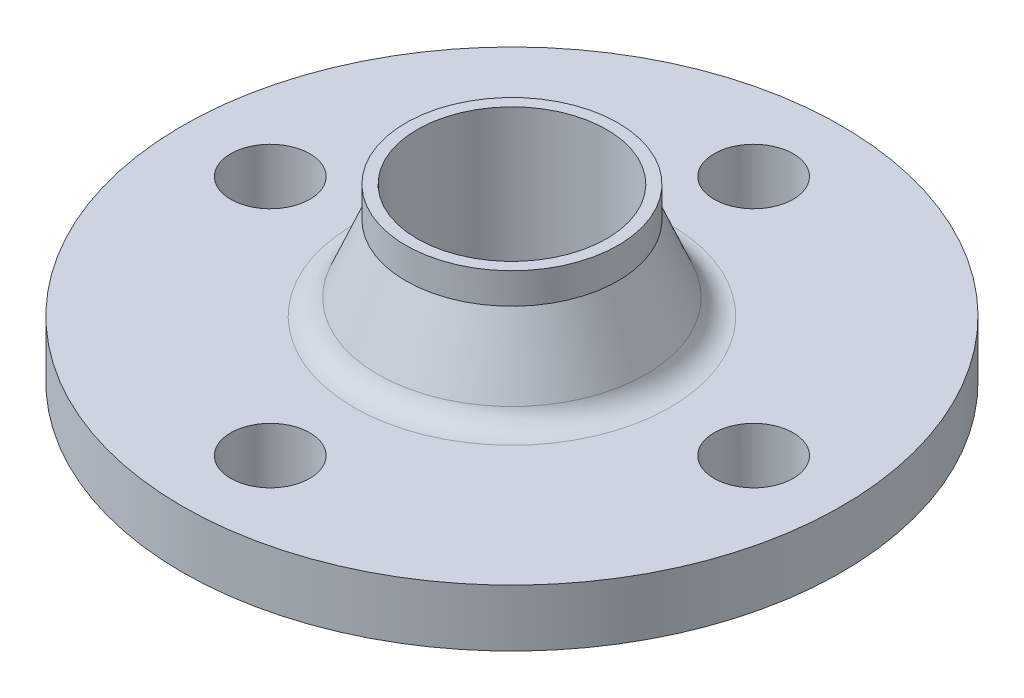
ISO-10303-21;
HEADER;
FILE_DESCRIPTION(('STEP AP214'),'2;1');
FILE_NAME('part.step','',(''),(''),'','','');
FILE_SCHEMA(('AUTOMOTIVE_DESIGN { 1 0 10303 214 1 1 1 1 }'));
ENDSEC;
DATA;
#1=APPLICATION_CONTEXT('core data for automotive mechanical design processes');
#2=APPLICATION_PROTOCOL_DEFINITION('international standard','automotive_design',2000,#1);
#3=PRODUCT_CONTEXT('',#1,'mechanical');
#4=PRODUCT('Part','Part','',(#3));
#5=PRODUCT_RELATED_PRODUCT_CATEGORY('part','',(#4));
#6=PRODUCT_DEFINITION_FORMATION('','',#4);
#7=PRODUCT_DEFINITION_CONTEXT('part definition',#1,'design');
#8=PRODUCT_DEFINITION('design','',#6,#7);
#9=PRODUCT_DEFINITION_SHAPE('','',#8);
#10=(LENGTH_UNIT() NAMED_UNIT(*) SI_UNIT(.MILLI.,.METRE.));
#11=(NAMED_UNIT(*) PLANE_ANGLE_UNIT() SI_UNIT($,.RADIAN.));
#12=(NAMED_UNIT(*) SI_UNIT($,.STERADIAN.) SOLID_ANGLE_UNIT());
#13=UNCERTAINTY_MEASURE_WITH_UNIT(LENGTH_MEASURE(1.E-05),#10,'distance_accuracy_value','');
#14=(GEOMETRIC_REPRESENTATION_CONTEXT(3) GLOBAL_UNCERTAINTY_ASSIGNED_CONTEXT((#13)) GLOBAL_UNIT_ASSIGNED_CONTEXT((#10,
#11,#12)) REPRESENTATION_CONTEXT('',''));
#15=CARTESIAN_POINT('',(0.,0.,0.));
#16=DIRECTION('',(0.,0.,1.));
#17=DIRECTION('',(1.,0.,0.));
#18=AXIS2_PLACEMENT_3D('',#15,#16,#17);
#19=CARTESIAN_POINT('',(75.,3.00000000000002,0.));
#20=DIRECTION('',(0.,-1.,0.));
#21=DIRECTION('',(0.,0.,-1.));
#22=AXIS2_PLACEMENT_3D('',#19,#20,#21);
#23=PLANE('',#22);
#24=CARTESIAN_POINT('',(-55.,2.99999999999999,-3.84063169722032E-13));
#25=DIRECTION('',(0.,1.,0.));
#26=DIRECTION('',(0.,0.,1.));
#27=AXIS2_PLACEMENT_3D('',#24,#25,#26);
#28=CIRCLE('',#27,9.);
#29=CARTESIAN_POINT('',(-46.8454545454546,3.00000000000002,-3.80833144956622));
#30=VERTEX_POINT('',#29);
#31=CARTESIAN_POINT('',(-46.8454545454546,2.99999999999999,3.80833144956551));
#32=VERTEX_POINT('',#31);
#33=EDGE_CURVE('E86',#30,#32,#28,.T.);
#34=ORIENTED_EDGE('',*,*,#33,.T.);
#35=CARTESIAN_POINT('',(0.,3.00000000000002,0.));
#36=DIRECTION('',(0.,-1.,0.));
#37=DIRECTION('',(0.,0.,-1.));
#38=AXIS2_PLACEMENT_3D('',#35,#36,#37);
#39=CIRCLE('',#38,47.);
#40=CARTESIAN_POINT('',(-3.80833144956606,3.00000000000002,46.8454545454546));
#41=VERTEX_POINT('',#40);
#42=EDGE_CURVE('E78',#41,#32,#39,.T.);
#43=ORIENTED_EDGE('',*,*,#42,.F.);
#44=CARTESIAN_POINT('',(-1.90445551968694E-13,2.99999999999999,55.));
#45=DIRECTION('',(0.,1.,0.));
#46=DIRECTION('',(0.,0.,1.));
#47=AXIS2_PLACEMENT_3D('',#44,#45,#46);
#48=CIRCLE('',#47,9.00000000000001);
#49=CARTESIAN_POINT('',(3.80833144956567,2.99999999999999,46.8454545454546));
#50=VERTEX_POINT('',#49);
#51=EDGE_CURVE('E117',#41,#50,#48,.T.);
#52=ORIENTED_EDGE('',*,*,#51,.T.);
#53=CARTESIAN_POINT('',(46.8454545454546,2.99999999999999,3.80833144956583));
#54=VERTEX_POINT('',#53);
#55=EDGE_CURVE('E81',#54,#50,#39,.T.);
#56=ORIENTED_EDGE('',*,*,#55,.F.);
#57=CARTESIAN_POINT('',(55.,2.99999999999999,0.));
#58=DIRECTION('',(0.,1.,0.));
#59=DIRECTION('',(0.,0.,1.));
#60=AXIS2_PLACEMENT_3D('',#57,#58,#59);
#61=CIRCLE('',#60,9.);
#62=CARTESIAN_POINT('',(46.8454545454546,3.00000000000002,-3.8083314495659));
#63=VERTEX_POINT('',#62);
#64=EDGE_CURVE('E140',#54,#63,#61,.T.);
#65=ORIENTED_EDGE('',*,*,#64,.T.);
#66=CARTESIAN_POINT('',(3.80833144956639,3.00000000000002,-46.8454545454545));
#67=VERTEX_POINT('',#66);
#68=EDGE_CURVE('E103',#67,#63,#39,.T.);
#69=ORIENTED_EDGE('',*,*,#68,.F.);
#70=CARTESIAN_POINT('',(5.7768078747537E-13,2.99999999999999,-55.));
#71=DIRECTION('',(0.,1.,0.));
#72=DIRECTION('',(0.,0.,1.));
#73=AXIS2_PLACEMENT_3D('',#70,#71,#72);
#74=CIRCLE('',#73,9.00000000000001);
#75=CARTESIAN_POINT('',(-3.80833144956535,2.99999999999999,-46.8454545454546));
#76=VERTEX_POINT('',#75);
#77=EDGE_CURVE('E127',#67,#76,#74,.T.);
#78=ORIENTED_EDGE('',*,*,#77,.T.);
#79=EDGE_CURVE('E79',#30,#76,#39,.T.);
#80=ORIENTED_EDGE('',*,*,#79,.F.);
#81=EDGE_LOOP('',(#34,#43,#52,#56,#65,#69,#78,#80));
#82=FACE_BOUND('',#81,.T.);
#83=CARTESIAN_POINT('',(0.,3.00000000000002,0.));
#84=DIRECTION('',(0.,1.,0.));
#85=DIRECTION('',(0.,0.,1.));
#86=AXIS2_PLACEMENT_3D('',#83,#84,#85);
#87=CIRCLE('',#86,75.);
#88=CARTESIAN_POINT('',(0.,3.00000000000002,75.));
#89=VERTEX_POINT('',#88);
#90=EDGE_CURVE('E139',#89,#89,#87,.T.);
#91=ORIENTED_EDGE('',*,*,#90,.F.);
#92=EDGE_LOOP('',(#91));
#93=FACE_BOUND('',#92,.T.);
#94=ADVANCED_FACE('F35',(#82,#93),#23,.T.);
#95=CARTESIAN_POINT('',(0.,3.00000000000002,0.));
#96=DIRECTION('',(0.,1.,0.));
#97=DIRECTION('',(0.,0.,1.));
#98=AXIS2_PLACEMENT_3D('',#95,#96,#97);
#99=CYLINDRICAL_SURFACE('',#98,75.);
#100=ORIENTED_EDGE('',*,*,#90,.T.);
#101=EDGE_LOOP('',(#100));
#102=FACE_BOUND('',#101,.T.);
#103=CARTESIAN_POINT('',(0.,16.,0.));
#104=DIRECTION('',(0.,1.,0.));
#105=DIRECTION('',(0.,0.,1.));
#106=AXIS2_PLACEMENT_3D('',#103,#104,#105);
#107=CIRCLE('',#106,75.);
#108=CARTESIAN_POINT('',(0.,16.,75.));
#109=VERTEX_POINT('',#108);
#110=EDGE_CURVE('E166',#109,#109,#107,.T.);
#111=ORIENTED_EDGE('',*,*,#110,.F.);
#112=EDGE_LOOP('',(#111));
#113=FACE_BOUND('',#112,.T.);
#114=ADVANCED_FACE('F187',(#102,#113),#99,.T.);
#115=CARTESIAN_POINT('',(0.,16.,0.));
#116=DIRECTION('',(0.,1.,0.));
#117=DIRECTION('',(0.,0.,1.));
#118=AXIS2_PLACEMENT_3D('',#115,#116,#117);
#119=PLANE('',#118);
#120=CARTESIAN_POINT('',(0.,16.,0.));
#121=DIRECTION('',(0.,1.,0.));
#122=DIRECTION('',(0.,0.,1.));
#123=AXIS2_PLACEMENT_3D('',#120,#121,#122);
#124=CIRCLE('',#123,36.0129845516935);
#125=CARTESIAN_POINT('',(0.,16.,36.0129845516935));
#126=VERTEX_POINT('',#125);
#127=EDGE_CURVE('E11',#126,#126,#124,.F.);
#128=ORIENTED_EDGE('',*,*,#127,.T.);
#129=EDGE_LOOP('',(#128));
#130=FACE_BOUND('',#129,.T.);
#131=CARTESIAN_POINT('',(-55.,16.,-3.84063169722032E-13));
#132=DIRECTION('',(0.,1.,0.));
#133=DIRECTION('',(0.,0.,1.));
#134=AXIS2_PLACEMENT_3D('',#131,#132,#133);
#135=CIRCLE('',#134,9.00000000000001);
#136=CARTESIAN_POINT('',(-55.,16.,8.99999999999963));
#137=VERTEX_POINT('',#136);
#138=EDGE_CURVE('E96',#137,#137,#135,.T.);
#139=ORIENTED_EDGE('',*,*,#138,.F.);
#140=EDGE_LOOP('',(#139));
#141=FACE_BOUND('',#140,.T.);
#142=CARTESIAN_POINT('',(55.,16.,0.));
#143=DIRECTION('',(0.,1.,0.));
#144=DIRECTION('',(0.,0.,1.));
#145=AXIS2_PLACEMENT_3D('',#142,#143,#144);
#146=CIRCLE('',#145,9.);
#147=CARTESIAN_POINT('',(55.,16.,9.));
#148=VERTEX_POINT('',#147);
#149=EDGE_CURVE('E88',#148,#148,#146,.T.);
#150=ORIENTED_EDGE('',*,*,#149,.F.);
#151=EDGE_LOOP('',(#150));
#152=FACE_BOUND('',#151,.T.);
#153=CARTESIAN_POINT('',(-1.90445551968694E-13,16.,55.));
#154=DIRECTION('',(0.,1.,0.));
#155=DIRECTION('',(0.,0.,1.));
#156=AXIS2_PLACEMENT_3D('',#153,#154,#155);
#157=CIRCLE('',#156,9.00000000000001);
#158=CARTESIAN_POINT('',(-1.90445551968694E-13,16.,64.));
#159=VERTEX_POINT('',#158);
#160=EDGE_CURVE('E120',#159,#159,#157,.T.);
#161=ORIENTED_EDGE('',*,*,#160,.F.);
#162=EDGE_LOOP('',(#161));
#163=FACE_BOUND('',#162,.T.);
#164=CARTESIAN_POINT('',(5.7768078747537E-13,16.,-55.));
#165=DIRECTION('',(0.,1.,0.));
#166=DIRECTION('',(0.,0.,1.));
#167=AXIS2_PLACEMENT_3D('',#164,#165,#166);
#168=CIRCLE('',#167,9.00000000000001);
#169=CARTESIAN_POINT('',(5.7768078747537E-13,16.,-46.));
#170=VERTEX_POINT('',#169);
#171=EDGE_CURVE('E118',#170,#170,#168,.T.);
#172=ORIENTED_EDGE('',*,*,#171,.F.);
#173=EDGE_LOOP('',(#172));
#174=FACE_BOUND('',#173,.T.);
#175=ORIENTED_EDGE('',*,*,#110,.T.);
#176=EDGE_LOOP('',(#175));
#177=FACE_BOUND('',#176,.T.);
#178=ADVANCED_FACE('F192',(#130,#141,#152,#163,#174,#177),#119,.T.);
#179=CARTESIAN_POINT('',(0.,16.,0.));
#180=DIRECTION('',(0.,-1.,0.));
#181=DIRECTION('',(0.,0.,1.));
#182=AXIS2_PLACEMENT_3D('',#179,#180,#181);
#183=CONICAL_SURFACE('',#182,32.,0.391797676816771);
#184=CARTESIAN_POINT('',(0.,19.7088970750846,0.));
#185=DIRECTION('',(0.,1.,0.));
#186=DIRECTION('',(0.,0.,1.));
#187=AXIS2_PLACEMENT_3D('',#184,#185,#186);
#188=CIRCLE('',#187,30.4676398926624);
#189=CARTESIAN_POINT('',(0.,19.7088970750846,30.4676398926624));
#190=VERTEX_POINT('',#189);
#191=EDGE_CURVE('E43',#190,#190,#188,.T.);
#192=ORIENTED_EDGE('',*,*,#191,.T.);
#193=EDGE_LOOP('',(#192));
#194=FACE_BOUND('',#193,.T.);
#195=CARTESIAN_POINT('',(0.,35.,0.));
#196=DIRECTION('',(0.,1.,0.));
#197=DIRECTION('',(0.,0.,1.));
#198=AXIS2_PLACEMENT_3D('',#195,#196,#197);
#199=CIRCLE('',#198,24.1500000000001);
#200=CARTESIAN_POINT('',(0.,35.,-24.15));
#201=VERTEX_POINT('',#200);
#202=EDGE_CURVE('E163',#201,#201,#199,.T.);
#203=ORIENTED_EDGE('',*,*,#202,.F.);
#204=EDGE_LOOP('',(#203));
#205=FACE_BOUND('',#204,.T.);
#206=ADVANCED_FACE('F175',(#194,#205),#183,.T.);
#207=CARTESIAN_POINT('',(0.,42.,0.));
#208=DIRECTION('',(0.,-1.,0.));
#209=DIRECTION('',(0.,0.,-1.));
#210=AXIS2_PLACEMENT_3D('',#207,#208,#209);
#211=CYLINDRICAL_SURFACE('',#210,24.15);
#212=CARTESIAN_POINT('',(0.,42.,0.));
#213=DIRECTION('',(0.,1.,0.));
#214=DIRECTION('',(0.,0.,1.));
#215=AXIS2_PLACEMENT_3D('',#212,#213,#214);
#216=CIRCLE('',#215,24.15);
#217=CARTESIAN_POINT('',(0.,42.,-24.15));
#218=VERTEX_POINT('',#217);
#219=EDGE_CURVE('E131',#218,#218,#216,.T.);
#220=CARTESIAN_POINT('',(0.,42.,-24.15));
#221=CARTESIAN_POINT('',(0.,41.9270833333333,-24.15));
#222=CARTESIAN_POINT('',(0.,41.8541666666667,-24.15));
#223=CARTESIAN_POINT('',(0.,41.7083333333333,-24.15));
#224=CARTESIAN_POINT('',(0.,41.6354166666667,-24.15));
#225=CARTESIAN_POINT('',(0.,41.4895833333333,-24.15));
#226=CARTESIAN_POINT('',(0.,41.4166666666667,-24.15));
#227=CARTESIAN_POINT('',(0.,41.2708333333333,-24.15));
#228=CARTESIAN_POINT('',(0.,41.1979166666667,-24.15));
#229=CARTESIAN_POINT('',(0.,41.0520833333333,-24.15));
#230=CARTESIAN_POINT('',(0.,40.9791666666667,-24.15));
#231=CARTESIAN_POINT('',(0.,40.8333333333333,-24.15));
#232=CARTESIAN_POINT('',(0.,40.7604166666667,-24.15));
#233=CARTESIAN_POINT('',(0.,40.6145833333333,-24.15));
#234=CARTESIAN_POINT('',(0.,40.5416666666667,-24.15));
#235=CARTESIAN_POINT('',(0.,40.3958333333333,-24.15));
#236=CARTESIAN_POINT('',(0.,40.3229166666667,-24.15));
#237=CARTESIAN_POINT('',(0.,40.1770833333333,-24.15));
#238=CARTESIAN_POINT('',(0.,40.1041666666667,-24.15));
#239=CARTESIAN_POINT('',(0.,39.9583333333333,-24.15));
#240=CARTESIAN_POINT('',(0.,39.8854166666667,-24.15));
#241=CARTESIAN_POINT('',(0.,39.7395833333333,-24.15));
#242=CARTESIAN_POINT('',(0.,39.6666666666667,-24.15));
#243=CARTESIAN_POINT('',(0.,39.5208333333333,-24.15));
#244=CARTESIAN_POINT('',(0.,39.4479166666667,-24.15));
#245=CARTESIAN_POINT('',(0.,39.3020833333333,-24.15));
#246=CARTESIAN_POINT('',(0.,39.2291666666667,-24.15));
#247=CARTESIAN_POINT('',(0.,39.0833333333333,-24.15));
#248=CARTESIAN_POINT('',(0.,39.0104166666667,-24.15));
#249=CARTESIAN_POINT('',(0.,38.8645833333333,-24.15));
#250=CARTESIAN_POINT('',(0.,38.7916666666667,-24.15));
#251=CARTESIAN_POINT('',(0.,38.6458333333333,-24.15));
#252=CARTESIAN_POINT('',(0.,38.5729166666667,-24.15));
#253=CARTESIAN_POINT('',(0.,38.4270833333333,-24.15));
#254=CARTESIAN_POINT('',(0.,38.3541666666667,-24.15));
#255=CARTESIAN_POINT('',(0.,38.2083333333333,-24.15));
#256=CARTESIAN_POINT('',(0.,38.1354166666667,-24.15));
#257=CARTESIAN_POINT('',(0.,37.9895833333333,-24.15));
#258=CARTESIAN_POINT('',(0.,37.9166666666667,-24.15));
#259=CARTESIAN_POINT('',(0.,37.7708333333333,-24.15));
#260=CARTESIAN_POINT('',(0.,37.6979166666667,-24.15));
#261=CARTESIAN_POINT('',(0.,37.5520833333333,-24.15));
#262=CARTESIAN_POINT('',(0.,37.4791666666667,-24.15));
#263=CARTESIAN_POINT('',(0.,37.3333333333333,-24.15));
#264=CARTESIAN_POINT('',(0.,37.2604166666667,-24.15));
#265=CARTESIAN_POINT('',(0.,37.1145833333333,-24.15));
#266=CARTESIAN_POINT('',(0.,37.0416666666667,-24.15));
#267=CARTESIAN_POINT('',(0.,36.8958333333333,-24.15));
#268=CARTESIAN_POINT('',(0.,36.8229166666667,-24.15));
#269=CARTESIAN_POINT('',(0.,36.6770833333333,-24.15));
#270=CARTESIAN_POINT('',(0.,36.6041666666667,-24.15));
#271=CARTESIAN_POINT('',(0.,36.4583333333333,-24.15));
#272=CARTESIAN_POINT('',(0.,36.3854166666667,-24.15));
#273=CARTESIAN_POINT('',(0.,36.2395833333333,-24.15));
#274=CARTESIAN_POINT('',(0.,36.1666666666667,-24.15));
#275=CARTESIAN_POINT('',(0.,36.0208333333333,-24.15));
#276=CARTESIAN_POINT('',(0.,35.9479166666667,-24.15));
#277=CARTESIAN_POINT('',(0.,35.8020833333333,-24.15));
#278=CARTESIAN_POINT('',(0.,35.7291666666667,-24.15));
#279=CARTESIAN_POINT('',(0.,35.5833333333333,-24.15));
#280=CARTESIAN_POINT('',(0.,35.5104166666667,-24.15));
#281=CARTESIAN_POINT('',(0.,35.3645833333333,-24.15));
#282=CARTESIAN_POINT('',(0.,35.2916666666667,-24.15));
#283=CARTESIAN_POINT('',(0.,35.1458333333333,-24.15));
#284=CARTESIAN_POINT('',(0.,35.0729166666667,-24.15));
#285=CARTESIAN_POINT('',(0.,35.,-24.15));
#286=B_SPLINE_CURVE_WITH_KNOTS('',3,(#220,#221,#222,#223,#224,#225,#226,#227,#228,#229,#230,
#231,#232,#233,#234,#235,#236,#237,#238,#239,#240,#241,#242,#243,#244,#245,#246,#247,#248,#249,
#250,#251,#252,#253,#254,#255,#256,#257,#258,#259,#260,#261,#262,#263,#264,#265,#266,#267,#268,
#269,#270,#271,#272,#273,#274,#275,#276,#277,#278,#279,#280,#281,#282,#283,#284,#285),
.UNSPECIFIED.,.F.,.F.,(4,2,2,2,2,2,2,2,2,2,2,2,2,2,2,2,2,2,2,2,2,2,2,2,2,2,2,2,2,2,2,2,4),(0.,
0.218750000000004,0.437500000000007,0.656250000000004,0.875000000000008,1.09375,
1.31250000000001,1.53125,1.75000000000001,1.96875000000001,2.18750000000001,2.40625000000001,
2.62500000000001,2.84375000000001,3.06250000000001,3.28125000000001,3.50000000000001,
3.71875000000001,3.93750000000001,4.15625000000001,4.375,4.59375000000001,4.81250000000001,
5.03125000000001,5.25000000000001,5.46875000000001,5.68750000000001,5.90625000000001,
6.12500000000001,6.34375000000001,6.56250000000001,6.78125000000001,7.00000000000001),.UNSPECIFIED.);
#287=EDGE_CURVE('BSEAM158',#218,#201,#286,.T.);
#288=ORIENTED_EDGE('',*,*,#219,.F.);
#289=ORIENTED_EDGE('',*,*,#202,.T.);
#290=ORIENTED_EDGE('',*,*,#287,.T.);
#291=ORIENTED_EDGE('',*,*,#287,.F.);
#292=EDGE_LOOP('',(#288,#290,#289,#291));
#293=FACE_BOUND('',#292,.T.);
#294=ADVANCED_FACE('F158',(#293),#211,.T.);
#295=CARTESIAN_POINT('',(0.,42.,0.));
#296=DIRECTION('',(0.,1.,0.));
#297=DIRECTION('',(0.,0.,1.));
#298=AXIS2_PLACEMENT_3D('',#295,#296,#297);
#299=PLANE('',#298);
#300=CARTESIAN_POINT('',(0.,42.,0.));
#301=DIRECTION('',(0.,1.,0.));
#302=DIRECTION('',(0.,0.,1.));
#303=AXIS2_PLACEMENT_3D('',#300,#301,#302);
#304=CIRCLE('',#303,21.55);
#305=CARTESIAN_POINT('',(0.,42.,21.55));
#306=VERTEX_POINT('',#305);
#307=EDGE_CURVE('E149',#306,#306,#304,.T.);
#308=ORIENTED_EDGE('',*,*,#307,.F.);
#309=EDGE_LOOP('',(#308));
#310=FACE_BOUND('',#309,.T.);
#311=ORIENTED_EDGE('',*,*,#219,.T.);
#312=EDGE_LOOP('',(#311));
#313=FACE_BOUND('',#312,.T.);
#314=ADVANCED_FACE('F155',(#310,#313),#299,.T.);
#315=CARTESIAN_POINT('',(0.,3.00000000000002,0.));
#316=DIRECTION('',(0.,1.,0.));
#317=DIRECTION('',(0.,0.,-1.));
#318=AXIS2_PLACEMENT_3D('',#315,#316,#317);
#319=CONICAL_SURFACE('',#318,47.,0.785398163397452);
#320=CARTESIAN_POINT('',(0.,0.,0.));
#321=DIRECTION('',(0.,-1.,0.));
#322=DIRECTION('',(0.,0.,-1.));
#323=AXIS2_PLACEMENT_3D('',#320,#321,#322);
#324=CIRCLE('',#323,44.);
#325=CARTESIAN_POINT('',(0.,0.,-44.));
#326=VERTEX_POINT('',#325);
#327=EDGE_CURVE('E128',#326,#326,#324,.T.);
#328=ORIENTED_EDGE('',*,*,#327,.F.);
#329=EDGE_LOOP('',(#328));
#330=FACE_BOUND('',#329,.T.);
#331=ORIENTED_EDGE('',*,*,#68,.T.);
#332=EDGE_CURVE('E101',#63,#54,#39,.T.);
#333=ORIENTED_EDGE('',*,*,#332,.T.);
#334=ORIENTED_EDGE('',*,*,#55,.T.);
#335=EDGE_CURVE('E100',#50,#41,#39,.T.);
#336=ORIENTED_EDGE('',*,*,#335,.T.);
#337=ORIENTED_EDGE('',*,*,#42,.T.);
#338=EDGE_CURVE('E74',#32,#30,#39,.T.);
#339=ORIENTED_EDGE('',*,*,#338,.T.);
#340=ORIENTED_EDGE('',*,*,#79,.T.);
#341=EDGE_CURVE('E102',#76,#67,#39,.T.);
#342=ORIENTED_EDGE('',*,*,#341,.T.);
#343=EDGE_LOOP('',(#331,#333,#334,#336,#337,#339,#340,#342));
#344=FACE_BOUND('',#343,.T.);
#345=ADVANCED_FACE('F98',(#330,#344),#319,.T.);
#346=CARTESIAN_POINT('',(0.,0.,0.));
#347=DIRECTION('',(0.,-1.,0.));
#348=DIRECTION('',(0.,0.,-1.));
#349=AXIS2_PLACEMENT_3D('',#346,#347,#348);
#350=PLANE('',#349);
#351=CARTESIAN_POINT('',(0.,0.,0.));
#352=DIRECTION('',(0.,1.,0.));
#353=DIRECTION('',(0.,0.,1.));
#354=AXIS2_PLACEMENT_3D('',#351,#352,#353);
#355=CIRCLE('',#354,21.55);
#356=CARTESIAN_POINT('',(0.,0.,21.55));
#357=VERTEX_POINT('',#356);
#358=EDGE_CURVE('E146',#357,#357,#355,.T.);
#359=ORIENTED_EDGE('',*,*,#358,.T.);
#360=EDGE_LOOP('',(#359));
#361=FACE_BOUND('',#360,.T.);
#362=ORIENTED_EDGE('',*,*,#327,.T.);
#363=EDGE_LOOP('',(#362));
#364=FACE_BOUND('',#363,.T.);
#365=ADVANCED_FACE('F204',(#361,#364),#350,.T.);
#366=CARTESIAN_POINT('',(5.74496705797587E-13,3.,-55.));
#367=DIRECTION('',(0.,-1.,0.));
#368=DIRECTION('',(0.,0.,-1.));
#369=AXIS2_PLACEMENT_3D('',#366,#367,#368);
#370=PLANE('',#369);
#371=EDGE_CURVE('E126',#76,#67,#74,.T.);
#372=ORIENTED_EDGE('',*,*,#371,.T.);
#373=ORIENTED_EDGE('',*,*,#341,.F.);
#374=EDGE_LOOP('',(#372,#373));
#375=FACE_BOUND('',#374,.T.);
#376=ADVANCED_FACE('F137',(#375),#370,.F.);
#377=CARTESIAN_POINT('',(5.7768078747537E-13,16.,-55.));
#378=DIRECTION('',(0.,1.,0.));
#379=DIRECTION('',(0.,0.,1.));
#380=AXIS2_PLACEMENT_3D('',#377,#378,#379);
#381=CYLINDRICAL_SURFACE('',#380,9.00000000000001);
#382=ORIENTED_EDGE('',*,*,#77,.F.);
#383=ORIENTED_EDGE('',*,*,#371,.F.);
#384=EDGE_LOOP('',(#382,#383));
#385=FACE_BOUND('',#384,.T.);
#386=ORIENTED_EDGE('',*,*,#171,.T.);
#387=EDGE_LOOP('',(#386));
#388=FACE_BOUND('',#387,.T.);
#389=ADVANCED_FACE('F211',(#385,#388),#381,.F.);
#390=CARTESIAN_POINT('',(-1.93629633646477E-13,3.,55.));
#391=DIRECTION('',(0.,-1.,0.));
#392=DIRECTION('',(0.,0.,-1.));
#393=AXIS2_PLACEMENT_3D('',#390,#391,#392);
#394=PLANE('',#393);
#395=EDGE_CURVE('E112',#50,#41,#48,.T.);
#396=ORIENTED_EDGE('',*,*,#395,.T.);
#397=ORIENTED_EDGE('',*,*,#335,.F.);
#398=EDGE_LOOP('',(#396,#397));
#399=FACE_BOUND('',#398,.T.);
#400=ADVANCED_FACE('F111',(#399),#394,.F.);
#401=CARTESIAN_POINT('',(-1.90445551968694E-13,16.,55.));
#402=DIRECTION('',(0.,1.,0.));
#403=DIRECTION('',(0.,0.,1.));
#404=AXIS2_PLACEMENT_3D('',#401,#402,#403);
#405=CYLINDRICAL_SURFACE('',#404,9.00000000000001);
#406=ORIENTED_EDGE('',*,*,#395,.F.);
#407=ORIENTED_EDGE('',*,*,#51,.F.);
#408=EDGE_LOOP('',(#406,#407));
#409=FACE_BOUND('',#408,.T.);
#410=ORIENTED_EDGE('',*,*,#160,.T.);
#411=EDGE_LOOP('',(#410));
#412=FACE_BOUND('',#411,.T.);
#413=ADVANCED_FACE('F115',(#409,#412),#405,.F.);
#414=CARTESIAN_POINT('',(55.,3.,0.));
#415=DIRECTION('',(0.,-1.,0.));
#416=DIRECTION('',(0.,0.,-1.));
#417=AXIS2_PLACEMENT_3D('',#414,#415,#416);
#418=PLANE('',#417);
#419=EDGE_CURVE('E56',#63,#54,#61,.T.);
#420=ORIENTED_EDGE('',*,*,#419,.T.);
#421=ORIENTED_EDGE('',*,*,#332,.F.);
#422=EDGE_LOOP('',(#420,#421));
#423=FACE_BOUND('',#422,.T.);
#424=ADVANCED_FACE('F218',(#423),#418,.F.);
#425=CARTESIAN_POINT('',(55.,16.,0.));
#426=DIRECTION('',(0.,1.,0.));
#427=DIRECTION('',(0.,0.,1.));
#428=AXIS2_PLACEMENT_3D('',#425,#426,#427);
#429=CYLINDRICAL_SURFACE('',#428,9.);
#430=ORIENTED_EDGE('',*,*,#419,.F.);
#431=ORIENTED_EDGE('',*,*,#64,.F.);
#432=EDGE_LOOP('',(#430,#431));
#433=FACE_BOUND('',#432,.T.);
#434=ORIENTED_EDGE('',*,*,#149,.T.);
#435=EDGE_LOOP('',(#434));
#436=FACE_BOUND('',#435,.T.);
#437=ADVANCED_FACE('F221',(#433,#436),#429,.F.);
#438=CARTESIAN_POINT('',(-55.,3.,-3.84063169722032E-13));
#439=DIRECTION('',(0.,-1.,0.));
#440=DIRECTION('',(0.,0.,-1.));
#441=AXIS2_PLACEMENT_3D('',#438,#439,#440);
#442=PLANE('',#441);
#443=EDGE_CURVE('E49',#32,#30,#28,.T.);
#444=ORIENTED_EDGE('',*,*,#443,.T.);
#445=ORIENTED_EDGE('',*,*,#338,.F.);
#446=EDGE_LOOP('',(#444,#445));
#447=FACE_BOUND('',#446,.T.);
#448=ADVANCED_FACE('F75',(#447),#442,.F.);
#449=CARTESIAN_POINT('',(-55.,16.,-3.84063169722032E-13));
#450=DIRECTION('',(0.,1.,0.));
#451=DIRECTION('',(0.,0.,1.));
#452=AXIS2_PLACEMENT_3D('',#449,#450,#451);
#453=CYLINDRICAL_SURFACE('',#452,9.00000000000001);
#454=ORIENTED_EDGE('',*,*,#443,.F.);
#455=ORIENTED_EDGE('',*,*,#33,.F.);
#456=EDGE_LOOP('',(#454,#455));
#457=FACE_BOUND('',#456,.T.);
#458=ORIENTED_EDGE('',*,*,#138,.T.);
#459=EDGE_LOOP('',(#458));
#460=FACE_BOUND('',#459,.T.);
#461=ADVANCED_FACE('F84',(#457,#460),#453,.F.);
#462=CARTESIAN_POINT('',(0.,42.,0.));
#463=DIRECTION('',(0.,1.,0.));
#464=DIRECTION('',(0.,0.,1.));
#465=AXIS2_PLACEMENT_3D('',#462,#463,#464);
#466=CYLINDRICAL_SURFACE('',#465,21.55);
#467=ORIENTED_EDGE('',*,*,#358,.F.);
#468=EDGE_LOOP('',(#467));
#469=FACE_BOUND('',#468,.T.);
#470=ORIENTED_EDGE('',*,*,#307,.T.);
#471=EDGE_LOOP('',(#470));
#472=FACE_BOUND('',#471,.T.);
#473=ADVANCED_FACE('F153',(#469,#472),#466,.F.);
#474=CARTESIAN_POINT('',(0.,22.,0.));
#475=DIRECTION('',(0.,1.,0.));
#476=DIRECTION('',(0.,0.,1.));
#477=AXIS2_PLACEMENT_3D('',#474,#475,#476);
#478=TOROIDAL_SURFACE('',#477,36.0129845516935,6.);
#479=ORIENTED_EDGE('',*,*,#127,.F.);
#480=EDGE_LOOP('',(#479));
#481=FACE_BOUND('',#480,.T.);
#482=ORIENTED_EDGE('',*,*,#191,.F.);
#483=EDGE_LOOP('',(#482));
#484=FACE_BOUND('',#483,.T.);
#485=ADVANCED_FACE('F37',(#481,#484),#478,.F.);
#486=CLOSED_SHELL('',(#94,#114,#178,#206,#294,#314,#345,#365,#376,#389,#400,#413,#424,#437,#448,
#461,#473,#485));
#487=MANIFOLD_SOLID_BREP('B2',#486);
#488=ADVANCED_BREP_SHAPE_REPRESENTATION('',(#18,#487),#14);
#489=SHAPE_DEFINITION_REPRESENTATION(#9,#488);
ENDSEC;
END-ISO-10303-21;
